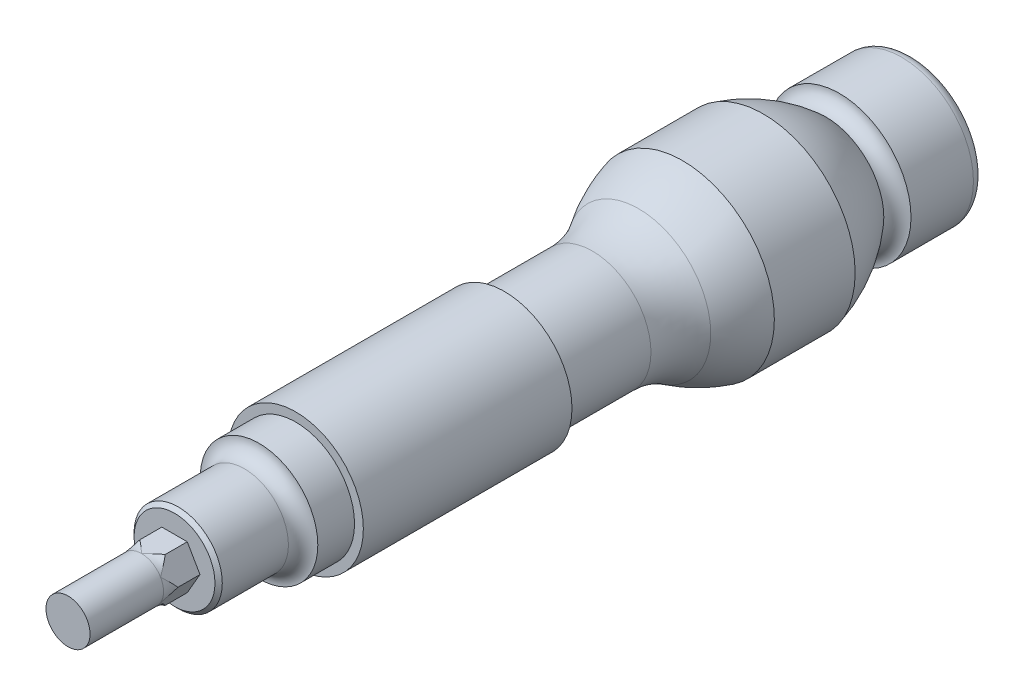
ISO-10303-21;
HEADER;
FILE_DESCRIPTION(('STEP AP214'),'2;1');
FILE_NAME('part.step','',(''),(''),'','','');
FILE_SCHEMA(('AUTOMOTIVE_DESIGN { 1 0 10303 214 1 1 1 1 }'));
ENDSEC;
DATA;
#1=APPLICATION_CONTEXT('core data for automotive mechanical design processes');
#2=APPLICATION_PROTOCOL_DEFINITION('international standard','automotive_design',2000,#1);
#3=PRODUCT_CONTEXT('',#1,'mechanical');
#4=PRODUCT('Part','Part','',(#3));
#5=PRODUCT_RELATED_PRODUCT_CATEGORY('part','',(#4));
#6=PRODUCT_DEFINITION_FORMATION('','',#4);
#7=PRODUCT_DEFINITION_CONTEXT('part definition',#1,'design');
#8=PRODUCT_DEFINITION('design','',#6,#7);
#9=PRODUCT_DEFINITION_SHAPE('','',#8);
#10=(LENGTH_UNIT() NAMED_UNIT(*) SI_UNIT(.MILLI.,.METRE.));
#11=(NAMED_UNIT(*) PLANE_ANGLE_UNIT() SI_UNIT($,.RADIAN.));
#12=(NAMED_UNIT(*) SI_UNIT($,.STERADIAN.) SOLID_ANGLE_UNIT());
#13=UNCERTAINTY_MEASURE_WITH_UNIT(LENGTH_MEASURE(1.E-05),#10,'distance_accuracy_value','');
#14=(GEOMETRIC_REPRESENTATION_CONTEXT(3) GLOBAL_UNCERTAINTY_ASSIGNED_CONTEXT((#13)) GLOBAL_UNIT_ASSIGNED_CONTEXT((#10,
#11,#12)) REPRESENTATION_CONTEXT('',''));
#15=CARTESIAN_POINT('',(0.,0.,0.));
#16=DIRECTION('',(0.,0.,1.));
#17=DIRECTION('',(1.,0.,0.));
#18=AXIS2_PLACEMENT_3D('',#15,#16,#17);
#19=CARTESIAN_POINT('',(3.46410161513776,0.,14.5));
#20=DIRECTION('',(-0.866025403784438,-0.5,0.));
#21=DIRECTION('',(0.5,-0.866025403784439,0.));
#22=AXIS2_PLACEMENT_3D('',#19,#20,#21);
#23=PLANE('',#22);
#24=CARTESIAN_POINT('',(2.59807621135332,1.5,4.5));
#25=CARTESIAN_POINT('',(2.59674655703731,1.50230302883182,4.4974977597433));
#26=CARTESIAN_POINT('',(2.59541689303764,1.50460607443626,4.49499549885701));
#27=CARTESIAN_POINT('',(2.39206625349649,1.85681971387321,4.11231690240028));
#28=CARTESIAN_POINT('',(2.18974554734384,2.20724945635276,3.73184875436438));
#29=CARTESIAN_POINT('',(1.8679830722733,2.76455841114403,3.20196483688396));
#30=CARTESIAN_POINT('',(1.75742455033807,2.95605138834557,3.03181844038893));
#31=CARTESIAN_POINT('',(1.52786252211219,3.35366448472136,2.71356209111123));
#32=CARTESIAN_POINT('',(1.40881715375348,3.55985711112441,2.56557439719002));
#33=CARTESIAN_POINT('',(1.28487555941977,3.77453024968147,2.43367229612633));
#34=B_SPLINE_CURVE_WITH_KNOTS('',3,(#24,#25,#26,#27,#28,#29,#30,#31,#32,#33),.UNSPECIFIED.,.F.,
.F.,(4,2,2,2,4),(0.,0.0109544511501079,1.67529006856402,2.51105860674039,3.35128077304245),.UNSPECIFIED.);
#35=CARTESIAN_POINT('',(2.59807621135332,1.5,4.5));
#36=VERTEX_POINT('',#35);
#37=CARTESIAN_POINT('',(1.73205080756888,3.,3.));
#38=VERTEX_POINT('',#37);
#39=EDGE_CURVE('E275',#36,#38,#34,.T.);
#40=ORIENTED_EDGE('',*,*,#39,.F.);
#41=CARTESIAN_POINT('',(2.59807621135332,1.5,4.5));
#42=CARTESIAN_POINT('',(2.59940586566931,1.49769697116819,4.49749775974329));
#43=CARTESIAN_POINT('',(2.60073552966899,1.49539392556376,4.494995498857));
#44=CARTESIAN_POINT('',(2.80408616921095,1.14318028612553,4.11231690239693));
#45=CARTESIAN_POINT('',(3.00640687536518,0.792750543643128,3.73184875435951));
#46=CARTESIAN_POINT('',(3.32816935043807,0.235441588847749,3.20196483687661));
#47=CARTESIAN_POINT('',(3.4387278723741,0.0439486116448324,3.0318184403807));
#48=CARTESIAN_POINT('',(3.66828990060169,-0.353664484733913,2.71356209110173));
#49=CARTESIAN_POINT('',(3.78733526896132,-0.559857111138531,2.56557439718013));
#50=CARTESIAN_POINT('',(3.91127686329607,-0.774530249697424,2.43367229611652));
#51=B_SPLINE_CURVE_WITH_KNOTS('',3,(#41,#42,#43,#44,#45,#46,#47,#48,#49,#50),.UNSPECIFIED.,.F.,
.F.,(4,2,2,2,4),(0.,0.0109544511501089,1.6752900685742,2.51105860675595,3.35128077306329),.UNSPECIFIED.);
#52=CARTESIAN_POINT('',(3.46410161513776,0.,3.));
#53=VERTEX_POINT('',#52);
#54=EDGE_CURVE('E311',#53,#36,#51,.F.);
#55=ORIENTED_EDGE('',*,*,#54,.F.);
#56=DIRECTION('',(0.,0.,-1.));
#57=VECTOR('',#56,1.);
#58=CARTESIAN_POINT('',(3.46410161513776,0.,14.5));
#59=LINE('',#58,#57);
#60=CARTESIAN_POINT('',(3.46410161513776,0.,0.));
#61=VERTEX_POINT('',#60);
#62=EDGE_CURVE('E77',#53,#61,#59,.T.);
#63=ORIENTED_EDGE('',*,*,#62,.T.);
#64=DIRECTION('',(-0.5,0.866025403784438,0.));
#65=VECTOR('',#64,1.);
#66=CARTESIAN_POINT('',(3.46410161513776,0.,0.));
#67=LINE('',#66,#65);
#68=CARTESIAN_POINT('',(1.73205080756888,3.,0.));
#69=VERTEX_POINT('',#68);
#70=EDGE_CURVE('E149',#61,#69,#67,.T.);
#71=ORIENTED_EDGE('',*,*,#70,.T.);
#72=DIRECTION('',(0.,0.,-1.));
#73=VECTOR('',#72,1.);
#74=CARTESIAN_POINT('',(1.73205080756888,3.,14.5));
#75=LINE('',#74,#73);
#76=EDGE_CURVE('E173',#38,#69,#75,.T.);
#77=ORIENTED_EDGE('',*,*,#76,.F.);
#78=EDGE_LOOP('',(#40,#55,#63,#71,#77));
#79=FACE_BOUND('',#78,.T.);
#80=ADVANCED_FACE('F41',(#79),#23,.F.);
#81=CARTESIAN_POINT('',(1.73205080756888,3.,14.5));
#82=DIRECTION('',(0.,-1.,0.));
#83=DIRECTION('',(0.,0.,-1.));
#84=AXIS2_PLACEMENT_3D('',#81,#82,#83);
#85=PLANE('',#84);
#86=CARTESIAN_POINT('',(0.,3.,4.5));
#87=CARTESIAN_POINT('',(-0.0026593318444822,3.,4.49749773920847));
#88=CARTESIAN_POINT('',(-0.00531865967591449,3.,4.49499547846833));
#89=CARTESIAN_POINT('',(-0.324815714859849,3.,4.19437004604627));
#90=CARTESIAN_POINT('',(-0.641697358033283,3.,3.89635475523398));
#91=CARTESIAN_POINT('',(-1.29819855455056,3.,3.32727802379802));
#92=CARTESIAN_POINT('',(-1.63771646135751,3.,3.05610809759644));
#93=CARTESIAN_POINT('',(-2.11898040748661,3.,2.73153018681572));
#94=CARTESIAN_POINT('',(-2.24331746468865,3.,2.65254580869575));
#95=CARTESIAN_POINT('',(-2.49675834719916,3.,2.50275253573944));
#96=CARTESIAN_POINT('',(-2.6258595738165,3.,2.43193926835726));
#97=CARTESIAN_POINT('',(-2.89073565176583,3.,2.29911816066051));
#98=CARTESIAN_POINT('',(-3.02657660408548,3.,2.23724054915606));
#99=CARTESIAN_POINT('',(-3.3032558347715,3.,2.12505741804358));
#100=CARTESIAN_POINT('',(-3.44410372986434,3.,2.07477572974168));
#101=CARTESIAN_POINT('',(-3.58715160115993,3.,2.03123597862711));
#102=B_SPLINE_CURVE_WITH_KNOTS('',3,(#86,#87,#88,#89,#90,#91,#92,#93,#94,#95,#96,#97,#98,#99,
#100,#101),.UNSPECIFIED.,.F.,.F.,(4,2,2,2,2,2,2,4),(0.,0.0109544511501083,1.31608851313812,
2.61571237230466,3.05735401275286,3.49875821390401,3.94605746549404,4.39426794895518),.UNSPECIFIED.);
#103=CARTESIAN_POINT('',(0.,3.,4.5));
#104=VERTEX_POINT('',#103);
#105=CARTESIAN_POINT('',(-1.73205080756888,3.,3.));
#106=VERTEX_POINT('',#105);
#107=EDGE_CURVE('E161',#104,#106,#102,.T.);
#108=ORIENTED_EDGE('',*,*,#107,.F.);
#109=CARTESIAN_POINT('',(0.,3.,4.5));
#110=CARTESIAN_POINT('',(0.0026593318444822,3.,4.49749773920847));
#111=CARTESIAN_POINT('',(0.00531865967591449,3.,4.49499547846833));
#112=CARTESIAN_POINT('',(0.324815714859849,3.,4.19437004604627));
#113=CARTESIAN_POINT('',(0.641697358033283,3.,3.89635475523398));
#114=CARTESIAN_POINT('',(1.29819855455056,3.,3.32727802379802));
#115=CARTESIAN_POINT('',(1.63771646135751,3.,3.05610809759644));
#116=CARTESIAN_POINT('',(2.11898040748661,3.,2.73153018681572));
#117=CARTESIAN_POINT('',(2.24331746468865,3.,2.65254580869575));
#118=CARTESIAN_POINT('',(2.49675834719916,3.,2.50275253573944));
#119=CARTESIAN_POINT('',(2.6258595738165,3.,2.43193926835726));
#120=CARTESIAN_POINT('',(2.89073565176583,3.,2.29911816066051));
#121=CARTESIAN_POINT('',(3.02657660408548,3.,2.23724054915606));
#122=CARTESIAN_POINT('',(3.3032558347715,3.,2.12505741804358));
#123=CARTESIAN_POINT('',(3.44410372986434,3.,2.07477572974168));
#124=CARTESIAN_POINT('',(3.58715160115993,3.,2.03123597862711));
#125=B_SPLINE_CURVE_WITH_KNOTS('',3,(#109,#110,#111,#112,#113,#114,#115,#116,#117,#118,#119,
#120,#121,#122,#123,#124),.UNSPECIFIED.,.F.,.F.,(4,2,2,2,2,2,2,4),(0.,0.0109544511501083,
1.31608851313812,2.61571237230466,3.05735401275286,3.49875821390401,3.94605746549404,
4.39426794895518),.UNSPECIFIED.);
#126=EDGE_CURVE('E287',#38,#104,#125,.F.);
#127=ORIENTED_EDGE('',*,*,#126,.F.);
#128=ORIENTED_EDGE('',*,*,#76,.T.);
#129=DIRECTION('',(-1.,0.,0.));
#130=VECTOR('',#129,1.);
#131=CARTESIAN_POINT('',(1.73205080756888,3.,0.));
#132=LINE('',#131,#130);
#133=CARTESIAN_POINT('',(-1.73205080756888,3.,0.));
#134=VERTEX_POINT('',#133);
#135=EDGE_CURVE('E364',#69,#134,#132,.T.);
#136=ORIENTED_EDGE('',*,*,#135,.T.);
#137=DIRECTION('',(0.,0.,-1.));
#138=VECTOR('',#137,1.);
#139=CARTESIAN_POINT('',(-1.73205080756888,3.,14.5));
#140=LINE('',#139,#138);
#141=EDGE_CURVE('E168',#106,#134,#140,.T.);
#142=ORIENTED_EDGE('',*,*,#141,.F.);
#143=EDGE_LOOP('',(#108,#127,#128,#136,#142));
#144=FACE_BOUND('',#143,.T.);
#145=ADVANCED_FACE('F299',(#144),#85,.F.);
#146=CARTESIAN_POINT('',(-1.73205080756888,3.,14.5));
#147=DIRECTION('',(0.866025403784439,-0.5,0.));
#148=DIRECTION('',(0.5,0.866025403784439,0.));
#149=AXIS2_PLACEMENT_3D('',#146,#147,#148);
#150=PLANE('',#149);
#151=CARTESIAN_POINT('',(-2.59807621135332,1.5,4.5));
#152=CARTESIAN_POINT('',(-2.59940586566936,1.49769697116811,4.49749775974339));
#153=CARTESIAN_POINT('',(-2.60073552966908,1.4953939255636,4.49499549885719));
#154=CARTESIAN_POINT('',(-2.80408616920028,1.14318028614386,4.11231690244428));
#155=CARTESIAN_POINT('',(-3.00640687533155,0.792750543701346,3.73184875442825));
#156=CARTESIAN_POINT('',(-3.32816935037108,0.235441588963789,3.20196483698024));
#157=CARTESIAN_POINT('',(-3.43872787229588,0.0439486117803156,3.0318184404968));
#158=CARTESIAN_POINT('',(-3.66828990049938,-0.353664484556722,2.71356209123586));
#159=CARTESIAN_POINT('',(-3.78733526884616,-0.559857110939087,2.56557439731984));
#160=CARTESIAN_POINT('',(-3.911276863166,-0.774530249472145,2.43367229625491));
#161=B_SPLINE_CURVE_WITH_KNOTS('',3,(#151,#152,#153,#154,#155,#156,#157,#158,#159,#160),
.UNSPECIFIED.,.F.,.F.,(4,2,2,2,4),(0.,0.0109544511501079,1.6752900684305,2.51105860653632,
3.35128077276909),.UNSPECIFIED.);
#162=CARTESIAN_POINT('',(-2.59807621135332,1.5,4.5));
#163=VERTEX_POINT('',#162);
#164=CARTESIAN_POINT('',(-3.46410161513776,0.,3.));
#165=VERTEX_POINT('',#164);
#166=EDGE_CURVE('E138',#163,#165,#161,.T.);
#167=ORIENTED_EDGE('',*,*,#166,.F.);
#168=CARTESIAN_POINT('',(-2.59807621135332,1.5,4.5));
#169=CARTESIAN_POINT('',(-2.59674655703728,1.50230302883188,4.49749775974338));
#170=CARTESIAN_POINT('',(-2.59541689303757,1.50460607443637,4.49499549885716));
#171=CARTESIAN_POINT('',(-2.39206625350477,1.85681971385872,4.11231690243757));
#172=CARTESIAN_POINT('',(-2.18974554737029,2.20724945630692,3.73184875441848));
#173=CARTESIAN_POINT('',(-1.86798307232604,2.7645584110527,3.20196483696552));
#174=CARTESIAN_POINT('',(-1.75742455039964,2.95605138823893,3.0318184404803));
#175=CARTESIAN_POINT('',(-1.52786252219271,3.3536644845819,2.7135620912168));
#176=CARTESIAN_POINT('',(-1.40881715384411,3.55985711096742,2.56557439729999));
#177=CARTESIAN_POINT('',(-1.28487555952215,3.77453024950415,2.43367229623525));
#178=B_SPLINE_CURVE_WITH_KNOTS('',3,(#168,#169,#170,#171,#172,#173,#174,#175,#176,#177),
.UNSPECIFIED.,.F.,.F.,(4,2,2,2,4),(0.,0.0109544511501087,1.67529006845092,2.51105860656752,
3.35128077281089),.UNSPECIFIED.);
#179=EDGE_CURVE('E150',#106,#163,#178,.F.);
#180=ORIENTED_EDGE('',*,*,#179,.F.);
#181=ORIENTED_EDGE('',*,*,#141,.T.);
#182=DIRECTION('',(-0.5,-0.866025403784439,0.));
#183=VECTOR('',#182,1.);
#184=CARTESIAN_POINT('',(-1.73205080756888,3.,0.));
#185=LINE('',#184,#183);
#186=CARTESIAN_POINT('',(-3.46410161513775,0.,0.));
#187=VERTEX_POINT('',#186);
#188=EDGE_CURVE('E166',#134,#187,#185,.T.);
#189=ORIENTED_EDGE('',*,*,#188,.T.);
#190=DIRECTION('',(0.,0.,-1.));
#191=VECTOR('',#190,1.);
#192=CARTESIAN_POINT('',(-3.46410161513775,0.,14.5));
#193=LINE('',#192,#191);
#194=EDGE_CURVE('E156',#165,#187,#193,.T.);
#195=ORIENTED_EDGE('',*,*,#194,.F.);
#196=EDGE_LOOP('',(#167,#180,#181,#189,#195));
#197=FACE_BOUND('',#196,.T.);
#198=ADVANCED_FACE('F164',(#197),#150,.F.);
#199=CARTESIAN_POINT('',(-3.46410161513775,0.,14.5));
#200=DIRECTION('',(0.866025403784438,0.5,0.));
#201=DIRECTION('',(-0.5,0.866025403784438,0.));
#202=AXIS2_PLACEMENT_3D('',#199,#200,#201);
#203=PLANE('',#202);
#204=CARTESIAN_POINT('',(-2.59807621135331,-1.5,4.5));
#205=CARTESIAN_POINT('',(-2.59674655703725,-1.50230302883193,4.49749775974343));
#206=CARTESIAN_POINT('',(-2.59541689303751,-1.50460607443647,4.49499549885727));
#207=CARTESIAN_POINT('',(-2.39206625351087,-1.85681971384825,4.11231690246462));
#208=CARTESIAN_POINT('',(-2.1897455473895,-2.20724945627366,3.73184875445775));
#209=CARTESIAN_POINT('',(-1.86798307236431,-2.7645584109864,3.20196483702472));
#210=CARTESIAN_POINT('',(-1.75742455044433,-2.95605138816153,3.03181844054663));
#211=CARTESIAN_POINT('',(-1.52786252225116,-3.35366448448066,2.71356209129343));
#212=CARTESIAN_POINT('',(-1.4088171539099,-3.55985711085347,2.56557439737981));
#213=CARTESIAN_POINT('',(-1.28487555959646,-3.77453024937544,2.43367229631432));
#214=B_SPLINE_CURVE_WITH_KNOTS('',3,(#204,#205,#206,#207,#208,#209,#210,#211,#212,#213),
.UNSPECIFIED.,.F.,.F.,(4,2,2,2,4),(0.,0.010954451150108,1.67529006836881,2.51105860644204,
3.3512807726428),.UNSPECIFIED.);
#215=CARTESIAN_POINT('',(-2.59807621135332,-1.5,4.5));
#216=VERTEX_POINT('',#215);
#217=CARTESIAN_POINT('',(-1.73205080756888,-3.,3.));
#218=VERTEX_POINT('',#217);
#219=EDGE_CURVE('E159',#216,#218,#214,.T.);
#220=ORIENTED_EDGE('',*,*,#219,.F.);
#221=CARTESIAN_POINT('',(-2.59807621135331,-1.5,4.5));
#222=CARTESIAN_POINT('',(-2.59940586566937,-1.49769697116808,4.49749775974342));
#223=CARTESIAN_POINT('',(-2.60073552966911,-1.49539392556355,4.49499549885726));
#224=CARTESIAN_POINT('',(-2.80408616919653,-1.14318028615042,4.11231690246119));
#225=CARTESIAN_POINT('',(-3.00640687531957,-0.792750543722116,3.73184875445276));
#226=CARTESIAN_POINT('',(-3.32816935034718,-0.235441589005178,3.2019648370172));
#227=CARTESIAN_POINT('',(-3.43872787226798,-0.0439486118286405,3.03181844053821));
#228=CARTESIAN_POINT('',(-3.6682899004629,0.353664484493519,2.7135620912837));
#229=CARTESIAN_POINT('',(-3.78733526880509,0.559857110867948,2.56557439736967));
#230=CARTESIAN_POINT('',(-3.91127686311961,0.774530249391791,2.43367229630427));
#231=B_SPLINE_CURVE_WITH_KNOTS('',3,(#221,#222,#223,#224,#225,#226,#227,#228,#229,#230),
.UNSPECIFIED.,.F.,.F.,(4,2,2,2,4),(0.,0.0109544511501084,1.67529006837925,2.51105860645798,
3.35128077266416),.UNSPECIFIED.);
#232=EDGE_CURVE('E141',#165,#216,#231,.F.);
#233=ORIENTED_EDGE('',*,*,#232,.F.);
#234=ORIENTED_EDGE('',*,*,#194,.T.);
#235=DIRECTION('',(0.5,-0.866025403784438,0.));
#236=VECTOR('',#235,1.);
#237=CARTESIAN_POINT('',(-3.46410161513775,0.,0.));
#238=LINE('',#237,#236);
#239=CARTESIAN_POINT('',(-1.73205080756887,-3.,0.));
#240=VERTEX_POINT('',#239);
#241=EDGE_CURVE('E360',#187,#240,#238,.T.);
#242=ORIENTED_EDGE('',*,*,#241,.T.);
#243=DIRECTION('',(0.,0.,-1.));
#244=VECTOR('',#243,1.);
#245=CARTESIAN_POINT('',(-1.73205080756887,-3.,14.5));
#246=LINE('',#245,#244);
#247=EDGE_CURVE('E169',#218,#240,#246,.T.);
#248=ORIENTED_EDGE('',*,*,#247,.F.);
#249=EDGE_LOOP('',(#220,#233,#234,#242,#248));
#250=FACE_BOUND('',#249,.T.);
#251=ADVANCED_FACE('F154',(#250),#203,.F.);
#252=CARTESIAN_POINT('',(-1.73205080756887,-3.,14.5));
#253=DIRECTION('',(0.,1.,0.));
#254=DIRECTION('',(-1.,0.,0.));
#255=AXIS2_PLACEMENT_3D('',#252,#253,#254);
#256=PLANE('',#255);
#257=CARTESIAN_POINT('',(0.,-3.,4.5));
#258=CARTESIAN_POINT('',(0.00265933184443127,-3.,4.49749773920841));
#259=CARTESIAN_POINT('',(0.00531865967581263,-3.,4.49499547846823));
#260=CARTESIAN_POINT('',(0.324815714821412,-3.,4.19437004607016));
#261=CARTESIAN_POINT('',(0.641697357967097,-3.,3.89635475529307));
#262=CARTESIAN_POINT('',(1.29819855441628,-3.,3.32727802391272));
#263=CARTESIAN_POINT('',(1.63771646118297,-3.,3.05610809773164));
#264=CARTESIAN_POINT('',(2.11898040727823,-3.,2.73153018695031));
#265=CARTESIAN_POINT('',(2.24331746449105,-3.,2.65254580881789));
#266=CARTESIAN_POINT('',(2.49675834702404,-3.,2.50275253583759));
#267=CARTESIAN_POINT('',(2.62585957365306,-3.,2.43193926844388));
#268=CARTESIAN_POINT('',(2.89073565162663,-3.,2.2991181607256));
#269=CARTESIAN_POINT('',(3.02657660395884,-3.,2.23724054921112));
#270=CARTESIAN_POINT('',(3.30325583467116,-3.,2.12505741808053));
#271=CARTESIAN_POINT('',(3.44410372977772,-3.,2.07477572977055));
#272=CARTESIAN_POINT('',(3.58715160108757,-3.,2.03123597864914));
#273=B_SPLINE_CURVE_WITH_KNOTS('',3,(#257,#258,#259,#260,#261,#262,#263,#264,#265,#266,#267,
#268,#269,#270,#271,#272),.UNSPECIFIED.,.F.,.F.,(4,2,2,2,2,2,2,4),(0.,0.0109544511501082,
1.31608851300503,2.61571237204134,3.05735401253683,3.49875821373528,3.94605746537196,
4.39426794887991),.UNSPECIFIED.);
#274=CARTESIAN_POINT('',(0.,-3.,4.5));
#275=VERTEX_POINT('',#274);
#276=CARTESIAN_POINT('',(1.73205080756888,-3.,3.));
#277=VERTEX_POINT('',#276);
#278=EDGE_CURVE('E66',#275,#277,#273,.T.);
#279=ORIENTED_EDGE('',*,*,#278,.F.);
#280=CARTESIAN_POINT('',(0.,-3.,4.5));
#281=CARTESIAN_POINT('',(-0.00265933184442953,-3.,4.49749773920841));
#282=CARTESIAN_POINT('',(-0.00531865967581065,-3.,4.49499547846822));
#283=CARTESIAN_POINT('',(-0.324815714821218,-3.,4.19437004607028));
#284=CARTESIAN_POINT('',(-0.641697357966763,-3.,3.89635475529337));
#285=CARTESIAN_POINT('',(-1.2981985544156,-3.,3.3272780239133));
#286=CARTESIAN_POINT('',(-1.63771646118209,-3.,3.05610809773232));
#287=CARTESIAN_POINT('',(-2.11898040727718,-3.,2.73153018695099));
#288=CARTESIAN_POINT('',(-2.24331746449006,-3.,2.65254580881851));
#289=CARTESIAN_POINT('',(-2.49675834702316,-3.,2.50275253583809));
#290=CARTESIAN_POINT('',(-2.62585957365223,-3.,2.43193926844431));
#291=CARTESIAN_POINT('',(-2.89073565162593,-3.,2.29911816072592));
#292=CARTESIAN_POINT('',(-3.0265766039582,-3.,2.2372405492114));
#293=CARTESIAN_POINT('',(-3.30325583467065,-3.,2.12505741808072));
#294=CARTESIAN_POINT('',(-3.44410372977728,-3.,2.07477572977069));
#295=CARTESIAN_POINT('',(-3.58715160108721,-3.,2.03123597864925));
#296=B_SPLINE_CURVE_WITH_KNOTS('',3,(#280,#281,#282,#283,#284,#285,#286,#287,#288,#289,#290,
#291,#292,#293,#294,#295),.UNSPECIFIED.,.F.,.F.,(4,2,2,2,2,2,2,4),(0.,0.0109544511501083,
1.31608851300436,2.61571237204002,3.05735401253574,3.49875821373443,3.94605746537134,
4.39426794887953),.UNSPECIFIED.);
#297=EDGE_CURVE('E267',#218,#275,#296,.F.);
#298=ORIENTED_EDGE('',*,*,#297,.F.);
#299=ORIENTED_EDGE('',*,*,#247,.T.);
#300=DIRECTION('',(1.,0.,0.));
#301=VECTOR('',#300,1.);
#302=CARTESIAN_POINT('',(-1.73205080756887,-3.,0.));
#303=LINE('',#302,#301);
#304=CARTESIAN_POINT('',(1.73205080756888,-3.,0.));
#305=VERTEX_POINT('',#304);
#306=EDGE_CURVE('E355',#240,#305,#303,.T.);
#307=ORIENTED_EDGE('',*,*,#306,.T.);
#308=DIRECTION('',(0.,0.,-1.));
#309=VECTOR('',#308,1.);
#310=CARTESIAN_POINT('',(1.73205080756888,-3.,14.5));
#311=LINE('',#310,#309);
#312=EDGE_CURVE('E176',#277,#305,#311,.T.);
#313=ORIENTED_EDGE('',*,*,#312,.F.);
#314=EDGE_LOOP('',(#279,#298,#299,#307,#313));
#315=FACE_BOUND('',#314,.T.);
#316=ADVANCED_FACE('F248',(#315),#256,.F.);
#317=CARTESIAN_POINT('',(1.73205080756888,-3.,14.5));
#318=DIRECTION('',(-0.866025403784439,0.5,0.));
#319=DIRECTION('',(-0.5,-0.866025403784439,0.));
#320=AXIS2_PLACEMENT_3D('',#317,#318,#319);
#321=PLANE('',#320);
#322=CARTESIAN_POINT('',(2.59807621135332,-1.5,4.5));
#323=CARTESIAN_POINT('',(2.59940586566934,-1.49769697116814,4.49749775974335));
#324=CARTESIAN_POINT('',(2.60073552966904,-1.49539392556367,4.49499549885711));
#325=CARTESIAN_POINT('',(2.80408616920486,-1.143180286136,4.11231690242397));
#326=CARTESIAN_POINT('',(3.00640687534598,-0.792750543676374,3.73184875439876));
#327=CARTESIAN_POINT('',(3.32816935039982,-0.235441588914013,3.20196483693579));
#328=CARTESIAN_POINT('',(3.43872787232943,-0.0439486117221998,3.031818440447));
#329=CARTESIAN_POINT('',(3.66828990054327,0.353664484632728,2.71356209117832));
#330=CARTESIAN_POINT('',(3.78733526889555,0.559857111024639,2.56557439725991));
#331=CARTESIAN_POINT('',(3.9112768632218,0.774530249568778,2.43367229619555));
#332=B_SPLINE_CURVE_WITH_KNOTS('',3,(#322,#323,#324,#325,#326,#327,#328,#329,#330,#331),
.UNSPECIFIED.,.F.,.F.,(4,2,2,2,4),(0.,0.0109544511501081,1.67529006849214,2.51105860663053,
3.35128077289528),.UNSPECIFIED.);
#333=CARTESIAN_POINT('',(2.59807621135332,-1.5,4.5));
#334=VERTEX_POINT('',#333);
#335=EDGE_CURVE('E11',#334,#53,#332,.T.);
#336=ORIENTED_EDGE('',*,*,#335,.F.);
#337=CARTESIAN_POINT('',(2.59807621135332,-1.5,4.5));
#338=CARTESIAN_POINT('',(2.59674655703732,-1.50230302883182,4.4974977597433));
#339=CARTESIAN_POINT('',(2.59541689303764,-1.50460607443625,4.49499549885701));
#340=CARTESIAN_POINT('',(2.39206625349648,-1.85681971387317,4.11231690240034));
#341=CARTESIAN_POINT('',(2.18974554734388,-2.20724945635268,3.73184875436446));
#342=CARTESIAN_POINT('',(1.86798307227338,-2.76455841114389,3.20196483688408));
#343=CARTESIAN_POINT('',(1.75742455033817,-2.95605138834541,3.03181844038906));
#344=CARTESIAN_POINT('',(1.52786252211231,-3.35366448472116,2.71356209111138));
#345=CARTESIAN_POINT('',(1.40881715375361,-3.55985711112417,2.56557439719019));
#346=CARTESIAN_POINT('',(1.28487555941993,-3.7745302496812,2.43367229612649));
#347=B_SPLINE_CURVE_WITH_KNOTS('',3,(#337,#338,#339,#340,#341,#342,#343,#344,#345,#346),
.UNSPECIFIED.,.F.,.F.,(4,2,2,2,4),(0.,0.0109544511501085,1.67529006856385,2.51105860674014,
3.35128077304211),.UNSPECIFIED.);
#348=EDGE_CURVE('E56',#277,#334,#347,.F.);
#349=ORIENTED_EDGE('',*,*,#348,.F.);
#350=ORIENTED_EDGE('',*,*,#312,.T.);
#351=DIRECTION('',(0.499999999999999,0.866025403784439,0.));
#352=VECTOR('',#351,1.);
#353=CARTESIAN_POINT('',(1.73205080756888,-3.,0.));
#354=LINE('',#353,#352);
#355=EDGE_CURVE('E351',#305,#61,#354,.T.);
#356=ORIENTED_EDGE('',*,*,#355,.T.);
#357=ORIENTED_EDGE('',*,*,#62,.F.);
#358=EDGE_LOOP('',(#336,#349,#350,#356,#357));
#359=FACE_BOUND('',#358,.T.);
#360=ADVANCED_FACE('F242',(#359),#321,.F.);
#361=CARTESIAN_POINT('',(6.,0.,0.));
#362=DIRECTION('',(0.,0.,1.));
#363=DIRECTION('',(1.,0.,0.));
#364=AXIS2_PLACEMENT_3D('',#361,#362,#363);
#365=PLANE('',#364);
#366=ORIENTED_EDGE('',*,*,#70,.F.);
#367=ORIENTED_EDGE('',*,*,#355,.F.);
#368=ORIENTED_EDGE('',*,*,#306,.F.);
#369=ORIENTED_EDGE('',*,*,#241,.F.);
#370=ORIENTED_EDGE('',*,*,#188,.F.);
#371=ORIENTED_EDGE('',*,*,#135,.F.);
#372=EDGE_LOOP('',(#366,#367,#368,#369,#370,#371));
#373=FACE_BOUND('',#372,.T.);
#374=CARTESIAN_POINT('',(0.,0.,0.));
#375=DIRECTION('',(0.,0.,1.));
#376=DIRECTION('',(1.,0.,0.));
#377=AXIS2_PLACEMENT_3D('',#374,#375,#376);
#378=CIRCLE('',#377,5.50000000000002);
#379=CARTESIAN_POINT('',(5.50000000000002,0.,0.));
#380=VERTEX_POINT('',#379);
#381=EDGE_CURVE('E224',#380,#380,#378,.T.);
#382=ORIENTED_EDGE('',*,*,#381,.T.);
#383=EDGE_LOOP('',(#382));
#384=FACE_BOUND('',#383,.T.);
#385=ADVANCED_FACE('F247',(#373,#384),#365,.T.);
#386=CARTESIAN_POINT('',(0.,0.,0.));
#387=DIRECTION('',(0.,0.,1.));
#388=DIRECTION('',(1.,0.,0.));
#389=AXIS2_PLACEMENT_3D('',#386,#387,#388);
#390=CYLINDRICAL_SURFACE('',#389,6.00000000000001);
#391=CARTESIAN_POINT('',(0.,0.,-0.499999999999979));
#392=DIRECTION('',(0.,0.,1.));
#393=DIRECTION('',(1.,0.,0.));
#394=AXIS2_PLACEMENT_3D('',#391,#392,#393);
#395=CIRCLE('',#394,6.00000000000001);
#396=CARTESIAN_POINT('',(6.00000000000001,0.,-0.499999999999979));
#397=VERTEX_POINT('',#396);
#398=EDGE_CURVE('E228',#397,#397,#395,.F.);
#399=ORIENTED_EDGE('',*,*,#398,.T.);
#400=EDGE_LOOP('',(#399));
#401=FACE_BOUND('',#400,.T.);
#402=CARTESIAN_POINT('',(0.,0.,-9.5));
#403=DIRECTION('',(0.,0.,1.));
#404=DIRECTION('',(1.,0.,0.));
#405=AXIS2_PLACEMENT_3D('',#402,#403,#404);
#406=CIRCLE('',#405,6.00000000000001);
#407=CARTESIAN_POINT('',(6.00000000000001,0.,-9.5));
#408=VERTEX_POINT('',#407);
#409=EDGE_CURVE('E215',#408,#408,#406,.T.);
#410=ORIENTED_EDGE('',*,*,#409,.T.);
#411=EDGE_LOOP('',(#410));
#412=FACE_BOUND('',#411,.T.);
#413=ADVANCED_FACE('F578',(#401,#412),#390,.T.);
#414=CARTESIAN_POINT('',(0.,0.,-9.5));
#415=DIRECTION('',(0.,0.,1.));
#416=DIRECTION('',(1.,0.,0.));
#417=AXIS2_PLACEMENT_3D('',#414,#415,#416);
#418=TOROIDAL_SURFACE('',#417,8.,1.99999999999999);
#419=CARTESIAN_POINT('',(0.,0.,-11.5));
#420=DIRECTION('',(0.,0.,1.));
#421=DIRECTION('',(1.,0.,0.));
#422=AXIS2_PLACEMENT_3D('',#419,#420,#421);
#423=CIRCLE('',#422,8.);
#424=CARTESIAN_POINT('',(8.,0.,-11.5));
#425=VERTEX_POINT('',#424);
#426=EDGE_CURVE('E212',#425,#425,#423,.T.);
#427=ORIENTED_EDGE('',*,*,#426,.T.);
#428=EDGE_LOOP('',(#427));
#429=FACE_BOUND('',#428,.T.);
#430=ORIENTED_EDGE('',*,*,#409,.F.);
#431=EDGE_LOOP('',(#430));
#432=FACE_BOUND('',#431,.T.);
#433=ADVANCED_FACE('F570',(#429,#432),#418,.F.);
#434=CARTESIAN_POINT('',(0.,0.,0.));
#435=DIRECTION('',(0.,0.,1.));
#436=DIRECTION('',(1.,0.,0.));
#437=AXIS2_PLACEMENT_3D('',#434,#435,#436);
#438=CYLINDRICAL_SURFACE('',#437,8.);
#439=CARTESIAN_POINT('',(0.,0.,-16.5));
#440=DIRECTION('',(0.,0.,1.));
#441=DIRECTION('',(1.,0.,0.));
#442=AXIS2_PLACEMENT_3D('',#439,#440,#441);
#443=CIRCLE('',#442,8.);
#444=CARTESIAN_POINT('',(8.,0.,-16.5));
#445=VERTEX_POINT('',#444);
#446=EDGE_CURVE('E209',#445,#445,#443,.T.);
#447=ORIENTED_EDGE('',*,*,#446,.T.);
#448=EDGE_LOOP('',(#447));
#449=FACE_BOUND('',#448,.T.);
#450=ORIENTED_EDGE('',*,*,#426,.F.);
#451=EDGE_LOOP('',(#450));
#452=FACE_BOUND('',#451,.T.);
#453=ADVANCED_FACE('F562',(#449,#452),#438,.T.);
#454=CARTESIAN_POINT('',(9.2,0.,-16.5));
#455=DIRECTION('',(0.,0.,1.));
#456=DIRECTION('',(1.,0.,0.));
#457=AXIS2_PLACEMENT_3D('',#454,#455,#456);
#458=PLANE('',#457);
#459=CARTESIAN_POINT('',(0.,0.,-16.5));
#460=DIRECTION('',(0.,0.,1.));
#461=DIRECTION('',(1.,0.,0.));
#462=AXIS2_PLACEMENT_3D('',#459,#460,#461);
#463=CIRCLE('',#462,9.2);
#464=CARTESIAN_POINT('',(9.2,0.,-16.5));
#465=VERTEX_POINT('',#464);
#466=EDGE_CURVE('E206',#465,#465,#463,.T.);
#467=ORIENTED_EDGE('',*,*,#466,.T.);
#468=EDGE_LOOP('',(#467));
#469=FACE_BOUND('',#468,.T.);
#470=ORIENTED_EDGE('',*,*,#446,.F.);
#471=EDGE_LOOP('',(#470));
#472=FACE_BOUND('',#471,.T.);
#473=ADVANCED_FACE('F554',(#469,#472),#458,.T.);
#474=CARTESIAN_POINT('',(0.,0.,0.));
#475=DIRECTION('',(0.,0.,1.));
#476=DIRECTION('',(1.,0.,0.));
#477=AXIS2_PLACEMENT_3D('',#474,#475,#476);
#478=CYLINDRICAL_SURFACE('',#477,9.2);
#479=CARTESIAN_POINT('',(0.,0.,-44.9));
#480=DIRECTION('',(0.,0.,1.));
#481=DIRECTION('',(1.,0.,0.));
#482=AXIS2_PLACEMENT_3D('',#479,#480,#481);
#483=CIRCLE('',#482,9.2);
#484=CARTESIAN_POINT('',(9.2,0.,-44.9));
#485=VERTEX_POINT('',#484);
#486=EDGE_CURVE('E203',#485,#485,#483,.T.);
#487=ORIENTED_EDGE('',*,*,#486,.T.);
#488=EDGE_LOOP('',(#487));
#489=FACE_BOUND('',#488,.T.);
#490=ORIENTED_EDGE('',*,*,#466,.F.);
#491=EDGE_LOOP('',(#490));
#492=FACE_BOUND('',#491,.T.);
#493=ADVANCED_FACE('F546',(#489,#492),#478,.T.);
#494=CARTESIAN_POINT('',(7.96,0.,-44.9));
#495=DIRECTION('',(0.,0.,-1.));
#496=DIRECTION('',(-1.,0.,0.));
#497=AXIS2_PLACEMENT_3D('',#494,#495,#496);
#498=PLANE('',#497);
#499=CARTESIAN_POINT('',(0.,0.,-44.9));
#500=DIRECTION('',(0.,0.,1.));
#501=DIRECTION('',(1.,0.,0.));
#502=AXIS2_PLACEMENT_3D('',#499,#500,#501);
#503=CIRCLE('',#502,7.96);
#504=CARTESIAN_POINT('',(7.96,0.,-44.9));
#505=VERTEX_POINT('',#504);
#506=EDGE_CURVE('E200',#505,#505,#503,.T.);
#507=ORIENTED_EDGE('',*,*,#506,.T.);
#508=EDGE_LOOP('',(#507));
#509=FACE_BOUND('',#508,.T.);
#510=ORIENTED_EDGE('',*,*,#486,.F.);
#511=EDGE_LOOP('',(#510));
#512=FACE_BOUND('',#511,.T.);
#513=ADVANCED_FACE('F538',(#509,#512),#498,.T.);
#514=CARTESIAN_POINT('',(0.,0.,0.));
#515=DIRECTION('',(0.,0.,1.));
#516=DIRECTION('',(1.,0.,0.));
#517=AXIS2_PLACEMENT_3D('',#514,#515,#516);
#518=CYLINDRICAL_SURFACE('',#517,7.96);
#519=CARTESIAN_POINT('',(0.,0.,-56.8918847603108));
#520=DIRECTION('',(0.,0.,1.));
#521=DIRECTION('',(1.,0.,0.));
#522=AXIS2_PLACEMENT_3D('',#519,#520,#521);
#523=CIRCLE('',#522,7.96000000000001);
#524=CARTESIAN_POINT('',(7.96000000000001,0.,-56.8918847603108));
#525=VERTEX_POINT('',#524);
#526=EDGE_CURVE('E197',#525,#525,#523,.T.);
#527=ORIENTED_EDGE('',*,*,#526,.T.);
#528=EDGE_LOOP('',(#527));
#529=FACE_BOUND('',#528,.T.);
#530=ORIENTED_EDGE('',*,*,#506,.F.);
#531=EDGE_LOOP('',(#530));
#532=FACE_BOUND('',#531,.T.);
#533=ADVANCED_FACE('F530',(#529,#532),#518,.T.);
#534=CARTESIAN_POINT('',(0.,0.,-56.8918847603108));
#535=DIRECTION('',(0.,0.,1.));
#536=DIRECTION('',(1.,0.,0.));
#537=AXIS2_PLACEMENT_3D('',#534,#535,#536);
#538=TOROIDAL_SURFACE('',#537,19.46,11.5);
#539=CARTESIAN_POINT('',(0.,0.,-63.1663324149265));
#540=DIRECTION('',(0.,0.,1.));
#541=DIRECTION('',(1.,0.,0.));
#542=AXIS2_PLACEMENT_3D('',#539,#540,#541);
#543=CIRCLE('',#542,9.8225051683808);
#544=CARTESIAN_POINT('',(9.8225051683808,0.,-63.1663324149265));
#545=VERTEX_POINT('',#544);
#546=EDGE_CURVE('E194',#545,#545,#543,.T.);
#547=ORIENTED_EDGE('',*,*,#546,.T.);
#548=EDGE_LOOP('',(#547));
#549=FACE_BOUND('',#548,.T.);
#550=ORIENTED_EDGE('',*,*,#526,.F.);
#551=EDGE_LOOP('',(#550));
#552=FACE_BOUND('',#551,.T.);
#553=ADVANCED_FACE('F522',(#549,#552),#538,.F.);
#554=CARTESIAN_POINT('',(0.,0.,-74.65));
#555=DIRECTION('',(0.,0.,1.));
#556=DIRECTION('',(1.,0.,0.));
#557=AXIS2_PLACEMENT_3D('',#554,#555,#556);
#558=DEGENERATE_TOROIDAL_SURFACE('',#557,7.81630434782612,21.0476179733836,.F.);
#559=CARTESIAN_POINT('',(0.,0.,-69.15));
#560=DIRECTION('',(0.,0.,1.));
#561=DIRECTION('',(1.,0.,0.));
#562=AXIS2_PLACEMENT_3D('',#559,#560,#561);
#563=CIRCLE('',#562,12.5);
#564=CARTESIAN_POINT('',(12.5,0.,-69.15));
#565=VERTEX_POINT('',#564);
#566=EDGE_CURVE('E191',#565,#565,#563,.T.);
#567=ORIENTED_EDGE('',*,*,#566,.T.);
#568=EDGE_LOOP('',(#567));
#569=FACE_BOUND('',#568,.T.);
#570=ORIENTED_EDGE('',*,*,#546,.F.);
#571=EDGE_LOOP('',(#570));
#572=FACE_BOUND('',#571,.T.);
#573=ADVANCED_FACE('F514',(#569,#572),#558,.F.);
#574=CARTESIAN_POINT('',(0.,0.,0.));
#575=DIRECTION('',(0.,0.,1.));
#576=DIRECTION('',(1.,0.,0.));
#577=AXIS2_PLACEMENT_3D('',#574,#575,#576);
#578=CYLINDRICAL_SURFACE('',#577,12.5);
#579=CARTESIAN_POINT('',(0.,0.,-80.15));
#580=DIRECTION('',(0.,0.,1.));
#581=DIRECTION('',(1.,0.,0.));
#582=AXIS2_PLACEMENT_3D('',#579,#580,#581);
#583=CIRCLE('',#582,12.5);
#584=CARTESIAN_POINT('',(12.5,0.,-80.15));
#585=VERTEX_POINT('',#584);
#586=EDGE_CURVE('E188',#585,#585,#583,.T.);
#587=ORIENTED_EDGE('',*,*,#586,.T.);
#588=EDGE_LOOP('',(#587));
#589=FACE_BOUND('',#588,.T.);
#590=ORIENTED_EDGE('',*,*,#566,.F.);
#591=EDGE_LOOP('',(#590));
#592=FACE_BOUND('',#591,.T.);
#593=ADVANCED_FACE('F506',(#589,#592),#578,.T.);
#594=CARTESIAN_POINT('',(0.,0.,-74.65));
#595=DIRECTION('',(0.,0.,1.));
#596=DIRECTION('',(1.,0.,0.));
#597=AXIS2_PLACEMENT_3D('',#594,#595,#596);
#598=DEGENERATE_TOROIDAL_SURFACE('',#597,7.81630434782612,21.0476179733836,.F.);
#599=CARTESIAN_POINT('',(0.,0.,-88.65));
#600=DIRECTION('',(0.,0.,1.));
#601=DIRECTION('',(1.,0.,0.));
#602=AXIS2_PLACEMENT_3D('',#599,#600,#601);
#603=CIRCLE('',#602,7.9);
#604=CARTESIAN_POINT('',(7.9,0.,-88.65));
#605=VERTEX_POINT('',#604);
#606=EDGE_CURVE('E185',#605,#605,#603,.T.);
#607=ORIENTED_EDGE('',*,*,#606,.T.);
#608=EDGE_LOOP('',(#607));
#609=FACE_BOUND('',#608,.T.);
#610=ORIENTED_EDGE('',*,*,#586,.F.);
#611=EDGE_LOOP('',(#610));
#612=FACE_BOUND('',#611,.T.);
#613=ADVANCED_FACE('F498',(#609,#612),#598,.F.);
#614=CARTESIAN_POINT('',(0.,0.,-88.65));
#615=DIRECTION('',(0.,0.,1.));
#616=DIRECTION('',(1.,0.,0.));
#617=AXIS2_PLACEMENT_3D('',#614,#615,#616);
#618=TOROIDAL_SURFACE('',#617,9.75,1.85);
#619=CARTESIAN_POINT('',(0.,0.,-90.5));
#620=DIRECTION('',(0.,0.,1.));
#621=DIRECTION('',(1.,0.,0.));
#622=AXIS2_PLACEMENT_3D('',#619,#620,#621);
#623=CIRCLE('',#622,9.75);
#624=CARTESIAN_POINT('',(9.75,0.,-90.5));
#625=VERTEX_POINT('',#624);
#626=EDGE_CURVE('E182',#625,#625,#623,.T.);
#627=ORIENTED_EDGE('',*,*,#626,.T.);
#628=EDGE_LOOP('',(#627));
#629=FACE_BOUND('',#628,.T.);
#630=ORIENTED_EDGE('',*,*,#606,.F.);
#631=EDGE_LOOP('',(#630));
#632=FACE_BOUND('',#631,.T.);
#633=ADVANCED_FACE('F491',(#629,#632),#618,.F.);
#634=CARTESIAN_POINT('',(0.,0.,0.));
#635=DIRECTION('',(0.,0.,1.));
#636=DIRECTION('',(1.,0.,0.));
#637=AXIS2_PLACEMENT_3D('',#634,#635,#636);
#638=CYLINDRICAL_SURFACE('',#637,9.75);
#639=CARTESIAN_POINT('',(0.,0.,-99.));
#640=DIRECTION('',(0.,0.,-1.));
#641=DIRECTION('',(-1.,0.,0.));
#642=AXIS2_PLACEMENT_3D('',#639,#640,#641);
#643=CIRCLE('',#642,9.75);
#644=CARTESIAN_POINT('',(-9.75,0.,-99.));
#645=VERTEX_POINT('',#644);
#646=EDGE_CURVE('E218',#645,#645,#643,.F.);
#647=ORIENTED_EDGE('',*,*,#646,.T.);
#648=EDGE_LOOP('',(#647));
#649=FACE_BOUND('',#648,.T.);
#650=ORIENTED_EDGE('',*,*,#626,.F.);
#651=EDGE_LOOP('',(#650));
#652=FACE_BOUND('',#651,.T.);
#653=ADVANCED_FACE('F484',(#649,#652),#638,.T.);
#654=CARTESIAN_POINT('',(0.,0.,-100.5));
#655=DIRECTION('',(0.,0.,-1.));
#656=DIRECTION('',(-1.,0.,0.));
#657=AXIS2_PLACEMENT_3D('',#654,#655,#656);
#658=PLANE('',#657);
#659=CARTESIAN_POINT('',(0.,0.,-100.5));
#660=DIRECTION('',(0.,0.,-1.));
#661=DIRECTION('',(-1.,0.,0.));
#662=AXIS2_PLACEMENT_3D('',#659,#660,#661);
#663=CIRCLE('',#662,8.25);
#664=CARTESIAN_POINT('',(-8.25,0.,-100.5));
#665=VERTEX_POINT('',#664);
#666=EDGE_CURVE('E221',#665,#665,#663,.T.);
#667=ORIENTED_EDGE('',*,*,#666,.T.);
#668=EDGE_LOOP('',(#667));
#669=FACE_BOUND('',#668,.T.);
#670=ADVANCED_FACE('F308',(#669),#658,.T.);
#671=CARTESIAN_POINT('',(0.,0.,-99.));
#672=DIRECTION('',(0.,0.,-1.));
#673=DIRECTION('',(-1.,0.,0.));
#674=AXIS2_PLACEMENT_3D('',#671,#672,#673);
#675=TOROIDAL_SURFACE('',#674,8.25,1.5);
#676=ORIENTED_EDGE('',*,*,#666,.F.);
#677=EDGE_LOOP('',(#676));
#678=FACE_BOUND('',#677,.T.);
#679=ORIENTED_EDGE('',*,*,#646,.F.);
#680=EDGE_LOOP('',(#679));
#681=FACE_BOUND('',#680,.T.);
#682=ADVANCED_FACE('F470',(#678,#681),#675,.T.);
#683=CARTESIAN_POINT('',(0.,0.,0.));
#684=DIRECTION('',(0.,0.,-1.));
#685=DIRECTION('',(-1.,0.,0.));
#686=AXIS2_PLACEMENT_3D('',#683,#684,#685);
#687=CONICAL_SURFACE('',#686,5.50000000000002,0.785398163397455);
#688=ORIENTED_EDGE('',*,*,#398,.F.);
#689=EDGE_LOOP('',(#688));
#690=FACE_BOUND('',#689,.T.);
#691=ORIENTED_EDGE('',*,*,#381,.F.);
#692=EDGE_LOOP('',(#691));
#693=FACE_BOUND('',#692,.T.);
#694=ADVANCED_FACE('F43',(#690,#693),#687,.T.);
#695=CARTESIAN_POINT('',(0.,0.,4.5));
#696=DIRECTION('',(0.,0.,-1.));
#697=DIRECTION('',(-1.,0.,0.));
#698=AXIS2_PLACEMENT_3D('',#695,#696,#697);
#699=TOROIDAL_SURFACE('',#698,5.65608891324553,2.65608891324553);
#700=ORIENTED_EDGE('',*,*,#166,.T.);
#701=ORIENTED_EDGE('',*,*,#232,.T.);
#702=CARTESIAN_POINT('',(0.,0.,4.5));
#703=DIRECTION('',(0.,0.,-1.));
#704=DIRECTION('',(-1.,0.,0.));
#705=AXIS2_PLACEMENT_3D('',#702,#703,#704);
#706=CIRCLE('',#705,3.);
#707=EDGE_CURVE('E143',#216,#163,#706,.T.);
#708=ORIENTED_EDGE('',*,*,#707,.T.);
#709=EDGE_LOOP('',(#700,#701,#708));
#710=FACE_BOUND('',#709,.T.);
#711=ADVANCED_FACE('F140',(#710),#699,.F.);
#712=ORIENTED_EDGE('',*,*,#179,.T.);
#713=EDGE_CURVE('E323',#163,#104,#706,.T.);
#714=ORIENTED_EDGE('',*,*,#713,.T.);
#715=ORIENTED_EDGE('',*,*,#107,.T.);
#716=EDGE_LOOP('',(#712,#714,#715));
#717=FACE_BOUND('',#716,.T.);
#718=ADVANCED_FACE('F383',(#717),#699,.F.);
#719=ORIENTED_EDGE('',*,*,#126,.T.);
#720=EDGE_CURVE('E328',#104,#36,#706,.T.);
#721=ORIENTED_EDGE('',*,*,#720,.T.);
#722=ORIENTED_EDGE('',*,*,#39,.T.);
#723=EDGE_LOOP('',(#719,#721,#722));
#724=FACE_BOUND('',#723,.T.);
#725=ADVANCED_FACE('F392',(#724),#699,.F.);
#726=ORIENTED_EDGE('',*,*,#219,.T.);
#727=ORIENTED_EDGE('',*,*,#297,.T.);
#728=EDGE_CURVE('E335',#275,#216,#706,.T.);
#729=ORIENTED_EDGE('',*,*,#728,.T.);
#730=EDGE_LOOP('',(#726,#727,#729));
#731=FACE_BOUND('',#730,.T.);
#732=ADVANCED_FACE('F417',(#731),#699,.F.);
#733=ORIENTED_EDGE('',*,*,#54,.T.);
#734=EDGE_CURVE('E334',#36,#334,#706,.T.);
#735=ORIENTED_EDGE('',*,*,#734,.T.);
#736=ORIENTED_EDGE('',*,*,#335,.T.);
#737=EDGE_LOOP('',(#733,#735,#736));
#738=FACE_BOUND('',#737,.T.);
#739=ADVANCED_FACE('F345',(#738),#699,.F.);
#740=ORIENTED_EDGE('',*,*,#278,.T.);
#741=ORIENTED_EDGE('',*,*,#348,.T.);
#742=EDGE_CURVE('E338',#334,#275,#706,.T.);
#743=ORIENTED_EDGE('',*,*,#742,.T.);
#744=EDGE_LOOP('',(#740,#741,#743));
#745=FACE_BOUND('',#744,.T.);
#746=ADVANCED_FACE('F396',(#745),#699,.F.);
#747=CARTESIAN_POINT('',(0.,0.,-9.5));
#748=DIRECTION('',(0.,0.,-1.));
#749=DIRECTION('',(-1.,0.,0.));
#750=AXIS2_PLACEMENT_3D('',#747,#748,#749);
#751=CYLINDRICAL_SURFACE('',#750,3.);
#752=ORIENTED_EDGE('',*,*,#734,.F.);
#753=ORIENTED_EDGE('',*,*,#720,.F.);
#754=ORIENTED_EDGE('',*,*,#713,.F.);
#755=ORIENTED_EDGE('',*,*,#707,.F.);
#756=ORIENTED_EDGE('',*,*,#728,.F.);
#757=ORIENTED_EDGE('',*,*,#742,.F.);
#758=EDGE_LOOP('',(#752,#753,#754,#755,#756,#757));
#759=FACE_BOUND('',#758,.T.);
#760=CARTESIAN_POINT('',(0.,0.,14.5));
#761=DIRECTION('',(0.,0.,1.));
#762=DIRECTION('',(1.,0.,0.));
#763=AXIS2_PLACEMENT_3D('',#760,#761,#762);
#764=CIRCLE('',#763,3.);
#765=CARTESIAN_POINT('',(3.,0.,14.5));
#766=VERTEX_POINT('',#765);
#767=EDGE_CURVE('E232',#766,#766,#764,.T.);
#768=ORIENTED_EDGE('',*,*,#767,.F.);
#769=EDGE_LOOP('',(#768));
#770=FACE_BOUND('',#769,.T.);
#771=ADVANCED_FACE('F393',(#759,#770),#751,.T.);
#772=CARTESIAN_POINT('',(0.,0.,14.5));
#773=DIRECTION('',(0.,0.,1.));
#774=DIRECTION('',(1.,0.,0.));
#775=AXIS2_PLACEMENT_3D('',#772,#773,#774);
#776=PLANE('',#775);
#777=ORIENTED_EDGE('',*,*,#767,.T.);
#778=EDGE_LOOP('',(#777));
#779=FACE_BOUND('',#778,.T.);
#780=ADVANCED_FACE('F250',(#779),#776,.T.);
#781=CLOSED_SHELL('',(#80,#145,#198,#251,#316,#360,#385,#413,#433,#453,#473,#493,#513,#533,#553,
#573,#593,#613,#633,#653,#670,#682,#694,#711,#718,#725,#732,#739,#746,#771,#780));
#782=MANIFOLD_SOLID_BREP('B2',#781);
#783=ADVANCED_BREP_SHAPE_REPRESENTATION('',(#18,#782),#14);
#784=SHAPE_DEFINITION_REPRESENTATION(#9,#783);
ENDSEC;
END-ISO-10303-21;
